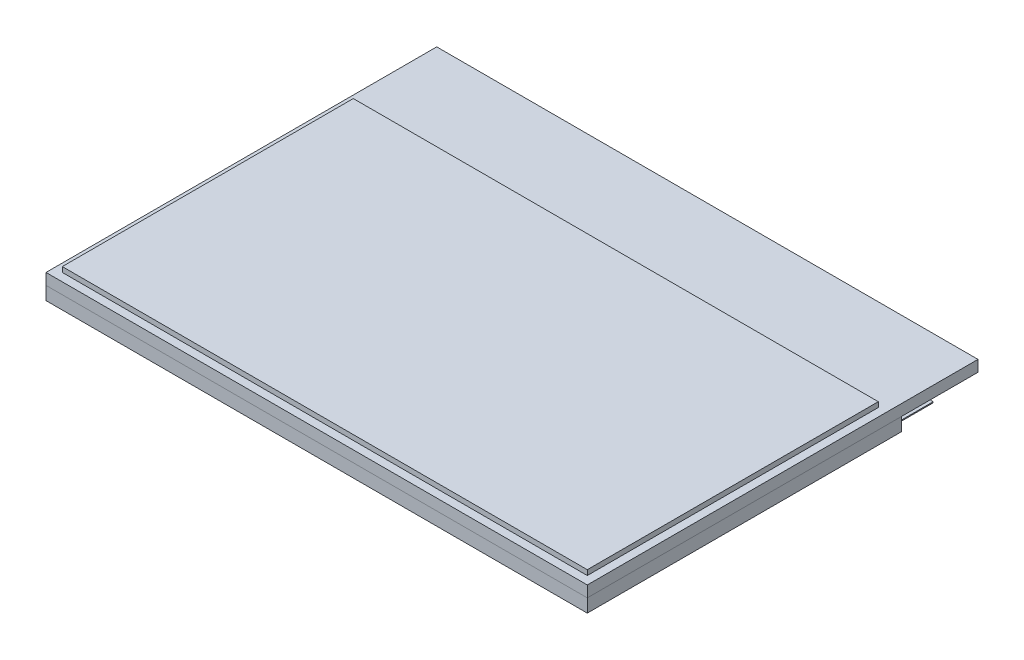
ISO-10303-21;
HEADER;
FILE_DESCRIPTION(('STEP AP214'),'2;1');
FILE_NAME('part.step','',(''),(''),'','','');
FILE_SCHEMA(('AUTOMOTIVE_DESIGN { 1 0 10303 214 1 1 1 1 }'));
ENDSEC;
DATA;
#1=APPLICATION_CONTEXT('core data for automotive mechanical design processes');
#2=APPLICATION_PROTOCOL_DEFINITION('international standard','automotive_design',2000,#1);
#3=PRODUCT_CONTEXT('',#1,'mechanical');
#4=PRODUCT('Part','Part','',(#3));
#5=PRODUCT_RELATED_PRODUCT_CATEGORY('part','',(#4));
#6=PRODUCT_DEFINITION_FORMATION('','',#4);
#7=PRODUCT_DEFINITION_CONTEXT('part definition',#1,'design');
#8=PRODUCT_DEFINITION('design','',#6,#7);
#9=PRODUCT_DEFINITION_SHAPE('','',#8);
#10=(LENGTH_UNIT() NAMED_UNIT(*) SI_UNIT(.MILLI.,.METRE.));
#11=(NAMED_UNIT(*) PLANE_ANGLE_UNIT() SI_UNIT($,.RADIAN.));
#12=(NAMED_UNIT(*) SI_UNIT($,.STERADIAN.) SOLID_ANGLE_UNIT());
#13=UNCERTAINTY_MEASURE_WITH_UNIT(LENGTH_MEASURE(1.E-05),#10,'distance_accuracy_value','');
#14=(GEOMETRIC_REPRESENTATION_CONTEXT(3) GLOBAL_UNCERTAINTY_ASSIGNED_CONTEXT((#13)) GLOBAL_UNIT_ASSIGNED_CONTEXT((#10,
#11,#12)) REPRESENTATION_CONTEXT('',''));
#15=CARTESIAN_POINT('',(0.,0.,0.));
#16=DIRECTION('',(0.,0.,1.));
#17=DIRECTION('',(1.,0.,0.));
#18=AXIS2_PLACEMENT_3D('',#15,#16,#17);
#19=CARTESIAN_POINT('',(-12.9,0.8,-5.1));
#20=DIRECTION('',(1.,0.,0.));
#21=DIRECTION('',(0.,0.,-1.));
#22=AXIS2_PLACEMENT_3D('',#19,#20,#21);
#23=PLANE('',#22);
#24=DIRECTION('',(0.,0.,1.));
#25=VECTOR('',#24,1.);
#26=CARTESIAN_POINT('',(-12.9,0.55,-5.1));
#27=LINE('',#26,#25);
#28=CARTESIAN_POINT('',(-12.9,0.55,-5.1));
#29=VERTEX_POINT('',#28);
#30=CARTESIAN_POINT('',(-12.9,0.55,9.2));
#31=VERTEX_POINT('',#30);
#32=EDGE_CURVE('E115',#29,#31,#27,.T.);
#33=ORIENTED_EDGE('',*,*,#32,.T.);
#34=DIRECTION('',(0.,-1.,0.));
#35=VECTOR('',#34,1.);
#36=CARTESIAN_POINT('',(-12.9,0.8,9.2));
#37=LINE('',#36,#35);
#38=CARTESIAN_POINT('',(-12.9,0.8,9.2));
#39=VERTEX_POINT('',#38);
#40=EDGE_CURVE('E12',#39,#31,#37,.T.);
#41=ORIENTED_EDGE('',*,*,#40,.F.);
#42=DIRECTION('',(0.,0.,1.));
#43=VECTOR('',#42,1.);
#44=CARTESIAN_POINT('',(-12.9,0.8,-5.1));
#45=LINE('',#44,#43);
#46=CARTESIAN_POINT('',(-12.9,0.8,-5.1));
#47=VERTEX_POINT('',#46);
#48=EDGE_CURVE('E103',#47,#39,#45,.T.);
#49=ORIENTED_EDGE('',*,*,#48,.F.);
#50=DIRECTION('',(0.,-1.,0.));
#51=VECTOR('',#50,1.);
#52=CARTESIAN_POINT('',(-12.9,0.8,-5.1));
#53=LINE('',#52,#51);
#54=EDGE_CURVE('E111',#47,#29,#53,.T.);
#55=ORIENTED_EDGE('',*,*,#54,.T.);
#56=EDGE_LOOP('',(#33,#41,#49,#55));
#57=FACE_BOUND('',#56,.T.);
#58=ADVANCED_FACE('F52',(#57),#23,.F.);
#59=CARTESIAN_POINT('',(-12.9,0.8,9.2));
#60=DIRECTION('',(0.,0.,-1.));
#61=DIRECTION('',(-1.,0.,0.));
#62=AXIS2_PLACEMENT_3D('',#59,#60,#61);
#63=PLANE('',#62);
#64=DIRECTION('',(1.,0.,0.));
#65=VECTOR('',#64,1.);
#66=CARTESIAN_POINT('',(-12.9,0.55,9.2));
#67=LINE('',#66,#65);
#68=CARTESIAN_POINT('',(12.9,0.55,9.2));
#69=VERTEX_POINT('',#68);
#70=EDGE_CURVE('E107',#31,#69,#67,.T.);
#71=ORIENTED_EDGE('',*,*,#70,.T.);
#72=DIRECTION('',(0.,-1.,0.));
#73=VECTOR('',#72,1.);
#74=CARTESIAN_POINT('',(12.9,0.8,9.2));
#75=LINE('',#74,#73);
#76=CARTESIAN_POINT('',(12.9,0.8,9.2));
#77=VERTEX_POINT('',#76);
#78=EDGE_CURVE('E60',#77,#69,#75,.T.);
#79=ORIENTED_EDGE('',*,*,#78,.F.);
#80=DIRECTION('',(1.,0.,0.));
#81=VECTOR('',#80,1.);
#82=CARTESIAN_POINT('',(-12.9,0.8,9.2));
#83=LINE('',#82,#81);
#84=EDGE_CURVE('E98',#39,#77,#83,.T.);
#85=ORIENTED_EDGE('',*,*,#84,.F.);
#86=ORIENTED_EDGE('',*,*,#40,.T.);
#87=EDGE_LOOP('',(#71,#79,#85,#86));
#88=FACE_BOUND('',#87,.T.);
#89=ADVANCED_FACE('F106',(#88),#63,.F.);
#90=CARTESIAN_POINT('',(12.9,0.8,-5.1));
#91=DIRECTION('',(-1.,0.,0.));
#92=DIRECTION('',(0.,0.,1.));
#93=AXIS2_PLACEMENT_3D('',#90,#91,#92);
#94=PLANE('',#93);
#95=DIRECTION('',(0.,0.,-1.));
#96=VECTOR('',#95,1.);
#97=CARTESIAN_POINT('',(12.9,0.55,-5.1));
#98=LINE('',#97,#96);
#99=CARTESIAN_POINT('',(12.9,0.55,-5.1));
#100=VERTEX_POINT('',#99);
#101=EDGE_CURVE('E85',#69,#100,#98,.T.);
#102=ORIENTED_EDGE('',*,*,#101,.T.);
#103=DIRECTION('',(0.,-1.,0.));
#104=VECTOR('',#103,1.);
#105=CARTESIAN_POINT('',(12.9,0.8,-5.1));
#106=LINE('',#105,#104);
#107=CARTESIAN_POINT('',(12.9,0.8,-5.1));
#108=VERTEX_POINT('',#107);
#109=EDGE_CURVE('E108',#108,#100,#106,.T.);
#110=ORIENTED_EDGE('',*,*,#109,.F.);
#111=DIRECTION('',(0.,0.,-1.));
#112=VECTOR('',#111,1.);
#113=CARTESIAN_POINT('',(12.9,0.8,-5.1));
#114=LINE('',#113,#112);
#115=EDGE_CURVE('E101',#77,#108,#114,.T.);
#116=ORIENTED_EDGE('',*,*,#115,.F.);
#117=ORIENTED_EDGE('',*,*,#78,.T.);
#118=EDGE_LOOP('',(#102,#110,#116,#117));
#119=FACE_BOUND('',#118,.T.);
#120=ADVANCED_FACE('F109',(#119),#94,.F.);
#121=CARTESIAN_POINT('',(-12.9,0.8,-5.1));
#122=DIRECTION('',(0.,0.,1.));
#123=DIRECTION('',(1.,0.,0.));
#124=AXIS2_PLACEMENT_3D('',#121,#122,#123);
#125=PLANE('',#124);
#126=DIRECTION('',(-1.,0.,0.));
#127=VECTOR('',#126,1.);
#128=CARTESIAN_POINT('',(-12.9,0.55,-5.1));
#129=LINE('',#128,#127);
#130=EDGE_CURVE('E91',#100,#29,#129,.T.);
#131=ORIENTED_EDGE('',*,*,#130,.T.);
#132=ORIENTED_EDGE('',*,*,#54,.F.);
#133=DIRECTION('',(-1.,0.,0.));
#134=VECTOR('',#133,1.);
#135=CARTESIAN_POINT('',(-12.9,0.8,-5.1));
#136=LINE('',#135,#134);
#137=EDGE_CURVE('E68',#108,#47,#136,.T.);
#138=ORIENTED_EDGE('',*,*,#137,.F.);
#139=ORIENTED_EDGE('',*,*,#109,.T.);
#140=EDGE_LOOP('',(#131,#132,#138,#139));
#141=FACE_BOUND('',#140,.T.);
#142=ADVANCED_FACE('F122',(#141),#125,.F.);
#143=CARTESIAN_POINT('',(0.,0.8,0.));
#144=DIRECTION('',(0.,1.,0.));
#145=DIRECTION('',(0.,0.,1.));
#146=AXIS2_PLACEMENT_3D('',#143,#144,#145);
#147=PLANE('',#146);
#148=ORIENTED_EDGE('',*,*,#48,.T.);
#149=ORIENTED_EDGE('',*,*,#84,.T.);
#150=ORIENTED_EDGE('',*,*,#115,.T.);
#151=ORIENTED_EDGE('',*,*,#137,.T.);
#152=EDGE_LOOP('',(#148,#149,#150,#151));
#153=FACE_BOUND('',#152,.T.);
#154=ADVANCED_FACE('F99',(#153),#147,.T.);
#155=CARTESIAN_POINT('',(0.,0.55,0.));
#156=DIRECTION('',(0.,1.,0.));
#157=DIRECTION('',(0.,0.,1.));
#158=AXIS2_PLACEMENT_3D('',#155,#156,#157);
#159=PLANE('',#158);
#160=ORIENTED_EDGE('',*,*,#32,.F.);
#161=ORIENTED_EDGE('',*,*,#130,.F.);
#162=ORIENTED_EDGE('',*,*,#101,.F.);
#163=ORIENTED_EDGE('',*,*,#70,.F.);
#164=EDGE_LOOP('',(#160,#161,#162,#163));
#165=FACE_BOUND('',#164,.T.);
#166=ADVANCED_FACE('F125',(#165),#159,.F.);
#167=CLOSED_SHELL('',(#58,#89,#120,#142,#154,#166));
#168=MANIFOLD_SOLID_BREP('B2',#167);
#169=CARTESIAN_POINT('',(-12.8,-0.7,9.1));
#170=DIRECTION('',(1.,0.,0.));
#171=DIRECTION('',(0.,0.,-1.));
#172=AXIS2_PLACEMENT_3D('',#169,#170,#171);
#173=PLANE('',#172);
#174=DIRECTION('',(0.,0.,-1.));
#175=VECTOR('',#174,1.);
#176=CARTESIAN_POINT('',(-12.8,-0.65,9.1));
#177=LINE('',#176,#175);
#178=CARTESIAN_POINT('',(-12.8,-0.65,9.1));
#179=VERTEX_POINT('',#178);
#180=CARTESIAN_POINT('',(-12.8,-0.65,-7.9));
#181=VERTEX_POINT('',#180);
#182=EDGE_CURVE('E249',#179,#181,#177,.T.);
#183=ORIENTED_EDGE('',*,*,#182,.T.);
#184=DIRECTION('',(0.,1.,0.));
#185=VECTOR('',#184,1.);
#186=CARTESIAN_POINT('',(-12.8,-0.7,-7.9));
#187=LINE('',#186,#185);
#188=CARTESIAN_POINT('',(-12.8,-0.7,-7.9));
#189=VERTEX_POINT('',#188);
#190=EDGE_CURVE('E50',#189,#181,#187,.T.);
#191=ORIENTED_EDGE('',*,*,#190,.F.);
#192=DIRECTION('',(0.,0.,-1.));
#193=VECTOR('',#192,1.);
#194=CARTESIAN_POINT('',(-12.8,-0.7,9.1));
#195=LINE('',#194,#193);
#196=CARTESIAN_POINT('',(-12.8,-0.7,9.1));
#197=VERTEX_POINT('',#196);
#198=EDGE_CURVE('E237',#197,#189,#195,.T.);
#199=ORIENTED_EDGE('',*,*,#198,.F.);
#200=DIRECTION('',(0.,1.,0.));
#201=VECTOR('',#200,1.);
#202=CARTESIAN_POINT('',(-12.8,-0.7,9.1));
#203=LINE('',#202,#201);
#204=EDGE_CURVE('E245',#197,#179,#203,.T.);
#205=ORIENTED_EDGE('',*,*,#204,.T.);
#206=EDGE_LOOP('',(#183,#191,#199,#205));
#207=FACE_BOUND('',#206,.T.);
#208=ADVANCED_FACE('F186',(#207),#173,.F.);
#209=CARTESIAN_POINT('',(-12.8,-0.7,-7.9));
#210=DIRECTION('',(0.,0.,1.));
#211=DIRECTION('',(1.,0.,0.));
#212=AXIS2_PLACEMENT_3D('',#209,#210,#211);
#213=PLANE('',#212);
#214=DIRECTION('',(1.,0.,0.));
#215=VECTOR('',#214,1.);
#216=CARTESIAN_POINT('',(-12.8,-0.65,-7.9));
#217=LINE('',#216,#215);
#218=CARTESIAN_POINT('',(12.8,-0.65,-7.9));
#219=VERTEX_POINT('',#218);
#220=EDGE_CURVE('E241',#181,#219,#217,.T.);
#221=ORIENTED_EDGE('',*,*,#220,.T.);
#222=DIRECTION('',(0.,1.,0.));
#223=VECTOR('',#222,1.);
#224=CARTESIAN_POINT('',(12.8,-0.7,-7.9));
#225=LINE('',#224,#223);
#226=CARTESIAN_POINT('',(12.8,-0.7,-7.9));
#227=VERTEX_POINT('',#226);
#228=EDGE_CURVE('E194',#227,#219,#225,.T.);
#229=ORIENTED_EDGE('',*,*,#228,.F.);
#230=DIRECTION('',(1.,0.,0.));
#231=VECTOR('',#230,1.);
#232=CARTESIAN_POINT('',(-12.8,-0.7,-7.9));
#233=LINE('',#232,#231);
#234=EDGE_CURVE('E232',#189,#227,#233,.T.);
#235=ORIENTED_EDGE('',*,*,#234,.F.);
#236=ORIENTED_EDGE('',*,*,#190,.T.);
#237=EDGE_LOOP('',(#221,#229,#235,#236));
#238=FACE_BOUND('',#237,.T.);
#239=ADVANCED_FACE('F240',(#238),#213,.F.);
#240=CARTESIAN_POINT('',(12.8,-0.7,9.1));
#241=DIRECTION('',(-1.,0.,0.));
#242=DIRECTION('',(0.,0.,1.));
#243=AXIS2_PLACEMENT_3D('',#240,#241,#242);
#244=PLANE('',#243);
#245=DIRECTION('',(0.,0.,1.));
#246=VECTOR('',#245,1.);
#247=CARTESIAN_POINT('',(12.8,-0.65,9.1));
#248=LINE('',#247,#246);
#249=CARTESIAN_POINT('',(12.8,-0.65,9.1));
#250=VERTEX_POINT('',#249);
#251=EDGE_CURVE('E219',#219,#250,#248,.T.);
#252=ORIENTED_EDGE('',*,*,#251,.T.);
#253=DIRECTION('',(0.,1.,0.));
#254=VECTOR('',#253,1.);
#255=CARTESIAN_POINT('',(12.8,-0.7,9.1));
#256=LINE('',#255,#254);
#257=CARTESIAN_POINT('',(12.8,-0.7,9.1));
#258=VERTEX_POINT('',#257);
#259=EDGE_CURVE('E242',#258,#250,#256,.T.);
#260=ORIENTED_EDGE('',*,*,#259,.F.);
#261=DIRECTION('',(0.,0.,1.));
#262=VECTOR('',#261,1.);
#263=CARTESIAN_POINT('',(12.8,-0.7,9.1));
#264=LINE('',#263,#262);
#265=EDGE_CURVE('E235',#227,#258,#264,.T.);
#266=ORIENTED_EDGE('',*,*,#265,.F.);
#267=ORIENTED_EDGE('',*,*,#228,.T.);
#268=EDGE_LOOP('',(#252,#260,#266,#267));
#269=FACE_BOUND('',#268,.T.);
#270=ADVANCED_FACE('F243',(#269),#244,.F.);
#271=CARTESIAN_POINT('',(-12.8,-0.7,9.1));
#272=DIRECTION('',(0.,0.,-1.));
#273=DIRECTION('',(-1.,0.,0.));
#274=AXIS2_PLACEMENT_3D('',#271,#272,#273);
#275=PLANE('',#274);
#276=DIRECTION('',(-1.,0.,0.));
#277=VECTOR('',#276,1.);
#278=CARTESIAN_POINT('',(-12.8,-0.65,9.1));
#279=LINE('',#278,#277);
#280=EDGE_CURVE('E225',#250,#179,#279,.T.);
#281=ORIENTED_EDGE('',*,*,#280,.T.);
#282=ORIENTED_EDGE('',*,*,#204,.F.);
#283=DIRECTION('',(-1.,0.,0.));
#284=VECTOR('',#283,1.);
#285=CARTESIAN_POINT('',(-12.8,-0.7,9.1));
#286=LINE('',#285,#284);
#287=EDGE_CURVE('E202',#258,#197,#286,.T.);
#288=ORIENTED_EDGE('',*,*,#287,.F.);
#289=ORIENTED_EDGE('',*,*,#259,.T.);
#290=EDGE_LOOP('',(#281,#282,#288,#289));
#291=FACE_BOUND('',#290,.T.);
#292=ADVANCED_FACE('F256',(#291),#275,.F.);
#293=CARTESIAN_POINT('',(0.,-0.7,0.));
#294=DIRECTION('',(0.,-1.,0.));
#295=DIRECTION('',(0.,0.,-1.));
#296=AXIS2_PLACEMENT_3D('',#293,#294,#295);
#297=PLANE('',#296);
#298=ORIENTED_EDGE('',*,*,#198,.T.);
#299=ORIENTED_EDGE('',*,*,#234,.T.);
#300=ORIENTED_EDGE('',*,*,#265,.T.);
#301=ORIENTED_EDGE('',*,*,#287,.T.);
#302=EDGE_LOOP('',(#298,#299,#300,#301));
#303=FACE_BOUND('',#302,.T.);
#304=ADVANCED_FACE('F233',(#303),#297,.T.);
#305=CARTESIAN_POINT('',(0.,-0.65,0.));
#306=DIRECTION('',(0.,-1.,0.));
#307=DIRECTION('',(0.,0.,-1.));
#308=AXIS2_PLACEMENT_3D('',#305,#306,#307);
#309=PLANE('',#308);
#310=ORIENTED_EDGE('',*,*,#182,.F.);
#311=ORIENTED_EDGE('',*,*,#280,.F.);
#312=ORIENTED_EDGE('',*,*,#251,.F.);
#313=ORIENTED_EDGE('',*,*,#220,.F.);
#314=EDGE_LOOP('',(#310,#311,#312,#313));
#315=FACE_BOUND('',#314,.T.);
#316=ADVANCED_FACE('F259',(#315),#309,.F.);
#317=CLOSED_SHELL('',(#208,#239,#270,#292,#304,#316));
#318=MANIFOLD_SOLID_BREP('B6',#317);
#319=CARTESIAN_POINT('',(13.3,-0.65,9.6));
#320=DIRECTION('',(-1.,0.,0.));
#321=DIRECTION('',(0.,0.,1.));
#322=AXIS2_PLACEMENT_3D('',#319,#320,#321);
#323=PLANE('',#322);
#324=DIRECTION('',(0.,0.,1.));
#325=VECTOR('',#324,1.);
#326=CARTESIAN_POINT('',(13.3,0.,9.6));
#327=LINE('',#326,#325);
#328=CARTESIAN_POINT('',(13.3,0.,-5.85));
#329=VERTEX_POINT('',#328);
#330=CARTESIAN_POINT('',(13.3,0.,9.6));
#331=VERTEX_POINT('',#330);
#332=EDGE_CURVE('E382',#329,#331,#327,.T.);
#333=ORIENTED_EDGE('',*,*,#332,.T.);
#334=DIRECTION('',(0.,1.,0.));
#335=VECTOR('',#334,1.);
#336=CARTESIAN_POINT('',(13.3,-0.65,9.6));
#337=LINE('',#336,#335);
#338=CARTESIAN_POINT('',(13.3,-0.65,9.6));
#339=VERTEX_POINT('',#338);
#340=EDGE_CURVE('E184',#339,#331,#337,.T.);
#341=ORIENTED_EDGE('',*,*,#340,.F.);
#342=DIRECTION('',(0.,0.,1.));
#343=VECTOR('',#342,1.);
#344=CARTESIAN_POINT('',(13.3,-0.65,9.6));
#345=LINE('',#344,#343);
#346=CARTESIAN_POINT('',(13.3,-0.65,-5.85));
#347=VERTEX_POINT('',#346);
#348=EDGE_CURVE('E370',#347,#339,#345,.T.);
#349=ORIENTED_EDGE('',*,*,#348,.F.);
#350=DIRECTION('',(0.,1.,0.));
#351=VECTOR('',#350,1.);
#352=CARTESIAN_POINT('',(13.3,-0.65,-5.85));
#353=LINE('',#352,#351);
#354=EDGE_CURVE('E378',#347,#329,#353,.T.);
#355=ORIENTED_EDGE('',*,*,#354,.T.);
#356=EDGE_LOOP('',(#333,#341,#349,#355));
#357=FACE_BOUND('',#356,.T.);
#358=ADVANCED_FACE('F319',(#357),#323,.F.);
#359=CARTESIAN_POINT('',(13.3,-0.65,9.6));
#360=DIRECTION('',(0.,0.,-1.));
#361=DIRECTION('',(-1.,0.,0.));
#362=AXIS2_PLACEMENT_3D('',#359,#360,#361);
#363=PLANE('',#362);
#364=DIRECTION('',(-1.,0.,0.));
#365=VECTOR('',#364,1.);
#366=CARTESIAN_POINT('',(13.3,0.,9.6));
#367=LINE('',#366,#365);
#368=CARTESIAN_POINT('',(-13.3,0.,9.6));
#369=VERTEX_POINT('',#368);
#370=EDGE_CURVE('E374',#331,#369,#367,.T.);
#371=ORIENTED_EDGE('',*,*,#370,.T.);
#372=DIRECTION('',(0.,1.,0.));
#373=VECTOR('',#372,1.);
#374=CARTESIAN_POINT('',(-13.3,-0.65,9.6));
#375=LINE('',#374,#373);
#376=CARTESIAN_POINT('',(-13.3,-0.65,9.6));
#377=VERTEX_POINT('',#376);
#378=EDGE_CURVE('E327',#377,#369,#375,.T.);
#379=ORIENTED_EDGE('',*,*,#378,.F.);
#380=DIRECTION('',(-1.,0.,0.));
#381=VECTOR('',#380,1.);
#382=CARTESIAN_POINT('',(13.3,-0.65,9.6));
#383=LINE('',#382,#381);
#384=EDGE_CURVE('E365',#339,#377,#383,.T.);
#385=ORIENTED_EDGE('',*,*,#384,.F.);
#386=ORIENTED_EDGE('',*,*,#340,.T.);
#387=EDGE_LOOP('',(#371,#379,#385,#386));
#388=FACE_BOUND('',#387,.T.);
#389=ADVANCED_FACE('F373',(#388),#363,.F.);
#390=CARTESIAN_POINT('',(-13.3,-0.65,9.6));
#391=DIRECTION('',(1.,0.,0.));
#392=DIRECTION('',(0.,0.,-1.));
#393=AXIS2_PLACEMENT_3D('',#390,#391,#392);
#394=PLANE('',#393);
#395=DIRECTION('',(0.,0.,-1.));
#396=VECTOR('',#395,1.);
#397=CARTESIAN_POINT('',(-13.3,0.,9.6));
#398=LINE('',#397,#396);
#399=CARTESIAN_POINT('',(-13.3,0.,-5.85));
#400=VERTEX_POINT('',#399);
#401=EDGE_CURVE('E352',#369,#400,#398,.T.);
#402=ORIENTED_EDGE('',*,*,#401,.T.);
#403=DIRECTION('',(0.,1.,0.));
#404=VECTOR('',#403,1.);
#405=CARTESIAN_POINT('',(-13.3,-0.65,-5.85));
#406=LINE('',#405,#404);
#407=CARTESIAN_POINT('',(-13.3,-0.65,-5.85));
#408=VERTEX_POINT('',#407);
#409=EDGE_CURVE('E375',#408,#400,#406,.T.);
#410=ORIENTED_EDGE('',*,*,#409,.F.);
#411=DIRECTION('',(0.,0.,-1.));
#412=VECTOR('',#411,1.);
#413=CARTESIAN_POINT('',(-13.3,-0.65,9.6));
#414=LINE('',#413,#412);
#415=EDGE_CURVE('E368',#377,#408,#414,.T.);
#416=ORIENTED_EDGE('',*,*,#415,.F.);
#417=ORIENTED_EDGE('',*,*,#378,.T.);
#418=EDGE_LOOP('',(#402,#410,#416,#417));
#419=FACE_BOUND('',#418,.T.);
#420=ADVANCED_FACE('F376',(#419),#394,.F.);
#421=CARTESIAN_POINT('',(13.3,-0.65,-5.85));
#422=DIRECTION('',(0.,0.,1.));
#423=DIRECTION('',(1.,0.,0.));
#424=AXIS2_PLACEMENT_3D('',#421,#422,#423);
#425=PLANE('',#424);
#426=DIRECTION('',(1.,0.,0.));
#427=VECTOR('',#426,1.);
#428=CARTESIAN_POINT('',(13.3,0.,-5.85));
#429=LINE('',#428,#427);
#430=EDGE_CURVE('E358',#400,#329,#429,.T.);
#431=ORIENTED_EDGE('',*,*,#430,.T.);
#432=ORIENTED_EDGE('',*,*,#354,.F.);
#433=DIRECTION('',(1.,0.,0.));
#434=VECTOR('',#433,1.);
#435=CARTESIAN_POINT('',(13.3,-0.65,-5.85));
#436=LINE('',#435,#434);
#437=EDGE_CURVE('E335',#408,#347,#436,.T.);
#438=ORIENTED_EDGE('',*,*,#437,.F.);
#439=ORIENTED_EDGE('',*,*,#409,.T.);
#440=EDGE_LOOP('',(#431,#432,#438,#439));
#441=FACE_BOUND('',#440,.T.);
#442=ADVANCED_FACE('F389',(#441),#425,.F.);
#443=CARTESIAN_POINT('',(0.,-0.65,0.));
#444=DIRECTION('',(0.,1.,0.));
#445=DIRECTION('',(0.,0.,1.));
#446=AXIS2_PLACEMENT_3D('',#443,#444,#445);
#447=PLANE('',#446);
#448=ORIENTED_EDGE('',*,*,#348,.T.);
#449=ORIENTED_EDGE('',*,*,#384,.T.);
#450=ORIENTED_EDGE('',*,*,#415,.T.);
#451=ORIENTED_EDGE('',*,*,#437,.T.);
#452=EDGE_LOOP('',(#448,#449,#450,#451));
#453=FACE_BOUND('',#452,.T.);
#454=ADVANCED_FACE('F366',(#453),#447,.F.);
#455=CARTESIAN_POINT('',(0.,0.,0.));
#456=DIRECTION('',(0.,1.,0.));
#457=DIRECTION('',(0.,0.,1.));
#458=AXIS2_PLACEMENT_3D('',#455,#456,#457);
#459=PLANE('',#458);
#460=ORIENTED_EDGE('',*,*,#332,.F.);
#461=ORIENTED_EDGE('',*,*,#430,.F.);
#462=ORIENTED_EDGE('',*,*,#401,.F.);
#463=ORIENTED_EDGE('',*,*,#370,.F.);
#464=EDGE_LOOP('',(#460,#461,#462,#463));
#465=FACE_BOUND('',#464,.T.);
#466=ADVANCED_FACE('F392',(#465),#459,.T.);
#467=CLOSED_SHELL('',(#358,#389,#420,#442,#454,#466));
#468=MANIFOLD_SOLID_BREP('B44',#467);
#469=CARTESIAN_POINT('',(13.3,0.55,9.6));
#470=DIRECTION('',(-1.,0.,0.));
#471=DIRECTION('',(0.,0.,1.));
#472=AXIS2_PLACEMENT_3D('',#469,#470,#471);
#473=PLANE('',#472);
#474=DIRECTION('',(0.,0.,-1.));
#475=VECTOR('',#474,1.);
#476=CARTESIAN_POINT('',(13.3,0.,9.6));
#477=LINE('',#476,#475);
#478=CARTESIAN_POINT('',(13.3,0.,9.6));
#479=VERTEX_POINT('',#478);
#480=CARTESIAN_POINT('',(13.3,0.,-9.6));
#481=VERTEX_POINT('',#480);
#482=EDGE_CURVE('E511',#479,#481,#477,.T.);
#483=ORIENTED_EDGE('',*,*,#482,.T.);
#484=DIRECTION('',(0.,-1.,0.));
#485=VECTOR('',#484,1.);
#486=CARTESIAN_POINT('',(13.3,0.55,-9.6));
#487=LINE('',#486,#485);
#488=CARTESIAN_POINT('',(13.3,0.55,-9.6));
#489=VERTEX_POINT('',#488);
#490=EDGE_CURVE('E317',#489,#481,#487,.T.);
#491=ORIENTED_EDGE('',*,*,#490,.F.);
#492=DIRECTION('',(0.,0.,-1.));
#493=VECTOR('',#492,1.);
#494=CARTESIAN_POINT('',(13.3,0.55,9.6));
#495=LINE('',#494,#493);
#496=CARTESIAN_POINT('',(13.3,0.55,9.6));
#497=VERTEX_POINT('',#496);
#498=EDGE_CURVE('E495',#497,#489,#495,.T.);
#499=ORIENTED_EDGE('',*,*,#498,.F.);
#500=DIRECTION('',(0.,-1.,0.));
#501=VECTOR('',#500,1.);
#502=CARTESIAN_POINT('',(13.3,0.55,9.6));
#503=LINE('',#502,#501);
#504=EDGE_CURVE('E507',#497,#479,#503,.T.);
#505=ORIENTED_EDGE('',*,*,#504,.T.);
#506=EDGE_LOOP('',(#483,#491,#499,#505));
#507=FACE_BOUND('',#506,.T.);
#508=ADVANCED_FACE('F443',(#507),#473,.F.);
#509=CARTESIAN_POINT('',(-13.3,0.55,-9.6));
#510=DIRECTION('',(0.,0.,1.));
#511=DIRECTION('',(1.,0.,0.));
#512=AXIS2_PLACEMENT_3D('',#509,#510,#511);
#513=PLANE('',#512);
#514=DIRECTION('',(-1.,0.,0.));
#515=VECTOR('',#514,1.);
#516=CARTESIAN_POINT('',(-13.3,0.,-9.6));
#517=LINE('',#516,#515);
#518=CARTESIAN_POINT('',(-13.3,0.,-9.6));
#519=VERTEX_POINT('',#518);
#520=EDGE_CURVE('E500',#481,#519,#517,.T.);
#521=ORIENTED_EDGE('',*,*,#520,.T.);
#522=DIRECTION('',(0.,-1.,0.));
#523=VECTOR('',#522,1.);
#524=CARTESIAN_POINT('',(-13.3,0.55,-9.6));
#525=LINE('',#524,#523);
#526=CARTESIAN_POINT('',(-13.3,0.55,-9.6));
#527=VERTEX_POINT('',#526);
#528=EDGE_CURVE('E452',#527,#519,#525,.T.);
#529=ORIENTED_EDGE('',*,*,#528,.F.);
#530=DIRECTION('',(-1.,0.,0.));
#531=VECTOR('',#530,1.);
#532=CARTESIAN_POINT('',(-13.3,0.55,-9.6));
#533=LINE('',#532,#531);
#534=EDGE_CURVE('E490',#489,#527,#533,.T.);
#535=ORIENTED_EDGE('',*,*,#534,.F.);
#536=ORIENTED_EDGE('',*,*,#490,.T.);
#537=EDGE_LOOP('',(#521,#529,#535,#536));
#538=FACE_BOUND('',#537,.T.);
#539=ADVANCED_FACE('F499',(#538),#513,.F.);
#540=CARTESIAN_POINT('',(-13.3,0.55,9.6));
#541=DIRECTION('',(1.,0.,0.));
#542=DIRECTION('',(0.,0.,-1.));
#543=AXIS2_PLACEMENT_3D('',#540,#541,#542);
#544=PLANE('',#543);
#545=DIRECTION('',(0.,0.,1.));
#546=VECTOR('',#545,1.);
#547=CARTESIAN_POINT('',(-13.3,0.,9.6));
#548=LINE('',#547,#546);
#549=CARTESIAN_POINT('',(-13.3,0.,9.6));
#550=VERTEX_POINT('',#549);
#551=EDGE_CURVE('E477',#519,#550,#548,.T.);
#552=ORIENTED_EDGE('',*,*,#551,.T.);
#553=DIRECTION('',(0.,-1.,0.));
#554=VECTOR('',#553,1.);
#555=CARTESIAN_POINT('',(-13.3,0.55,9.6));
#556=LINE('',#555,#554);
#557=CARTESIAN_POINT('',(-13.3,0.55,9.6));
#558=VERTEX_POINT('',#557);
#559=EDGE_CURVE('E502',#558,#550,#556,.T.);
#560=ORIENTED_EDGE('',*,*,#559,.F.);
#561=DIRECTION('',(0.,0.,1.));
#562=VECTOR('',#561,1.);
#563=CARTESIAN_POINT('',(-13.3,0.55,9.6));
#564=LINE('',#563,#562);
#565=EDGE_CURVE('E493',#527,#558,#564,.T.);
#566=ORIENTED_EDGE('',*,*,#565,.F.);
#567=ORIENTED_EDGE('',*,*,#528,.T.);
#568=EDGE_LOOP('',(#552,#560,#566,#567));
#569=FACE_BOUND('',#568,.T.);
#570=ADVANCED_FACE('F503',(#569),#544,.F.);
#571=CARTESIAN_POINT('',(-13.3,0.55,9.6));
#572=DIRECTION('',(0.,0.,-1.));
#573=DIRECTION('',(-1.,0.,0.));
#574=AXIS2_PLACEMENT_3D('',#571,#572,#573);
#575=PLANE('',#574);
#576=DIRECTION('',(1.,0.,0.));
#577=VECTOR('',#576,1.);
#578=CARTESIAN_POINT('',(-13.3,0.,9.6));
#579=LINE('',#578,#577);
#580=EDGE_CURVE('E483',#550,#479,#579,.T.);
#581=ORIENTED_EDGE('',*,*,#580,.T.);
#582=ORIENTED_EDGE('',*,*,#504,.F.);
#583=DIRECTION('',(1.,0.,0.));
#584=VECTOR('',#583,1.);
#585=CARTESIAN_POINT('',(-13.3,0.55,9.6));
#586=LINE('',#585,#584);
#587=EDGE_CURVE('E460',#558,#497,#586,.T.);
#588=ORIENTED_EDGE('',*,*,#587,.F.);
#589=ORIENTED_EDGE('',*,*,#559,.T.);
#590=EDGE_LOOP('',(#581,#582,#588,#589));
#591=FACE_BOUND('',#590,.T.);
#592=ADVANCED_FACE('F524',(#591),#575,.F.);
#593=CARTESIAN_POINT('',(0.,0.55,0.));
#594=DIRECTION('',(0.,-1.,0.));
#595=DIRECTION('',(0.,0.,-1.));
#596=AXIS2_PLACEMENT_3D('',#593,#594,#595);
#597=PLANE('',#596);
#598=ORIENTED_EDGE('',*,*,#498,.T.);
#599=ORIENTED_EDGE('',*,*,#534,.T.);
#600=ORIENTED_EDGE('',*,*,#565,.T.);
#601=ORIENTED_EDGE('',*,*,#587,.T.);
#602=EDGE_LOOP('',(#598,#599,#600,#601));
#603=FACE_BOUND('',#602,.T.);
#604=ADVANCED_FACE('F491',(#603),#597,.F.);
#605=CARTESIAN_POINT('',(0.,0.,0.));
#606=DIRECTION('',(0.,-1.,0.));
#607=DIRECTION('',(0.,0.,-1.));
#608=AXIS2_PLACEMENT_3D('',#605,#606,#607);
#609=PLANE('',#608);
#610=ORIENTED_EDGE('',*,*,#482,.F.);
#611=ORIENTED_EDGE('',*,*,#580,.F.);
#612=ORIENTED_EDGE('',*,*,#551,.F.);
#613=ORIENTED_EDGE('',*,*,#520,.F.);
#614=EDGE_LOOP('',(#610,#611,#612,#613));
#615=FACE_BOUND('',#614,.T.);
#616=ADVANCED_FACE('F527',(#615),#609,.T.);
#617=CLOSED_SHELL('',(#508,#539,#570,#592,#604,#616));
#618=MANIFOLD_SOLID_BREP('B178',#617);
#619=ADVANCED_BREP_SHAPE_REPRESENTATION('',(#18,#168,#318,#468,#618),#14);
#620=SHAPE_DEFINITION_REPRESENTATION(#9,#619);
ENDSEC;
END-ISO-10303-21;
